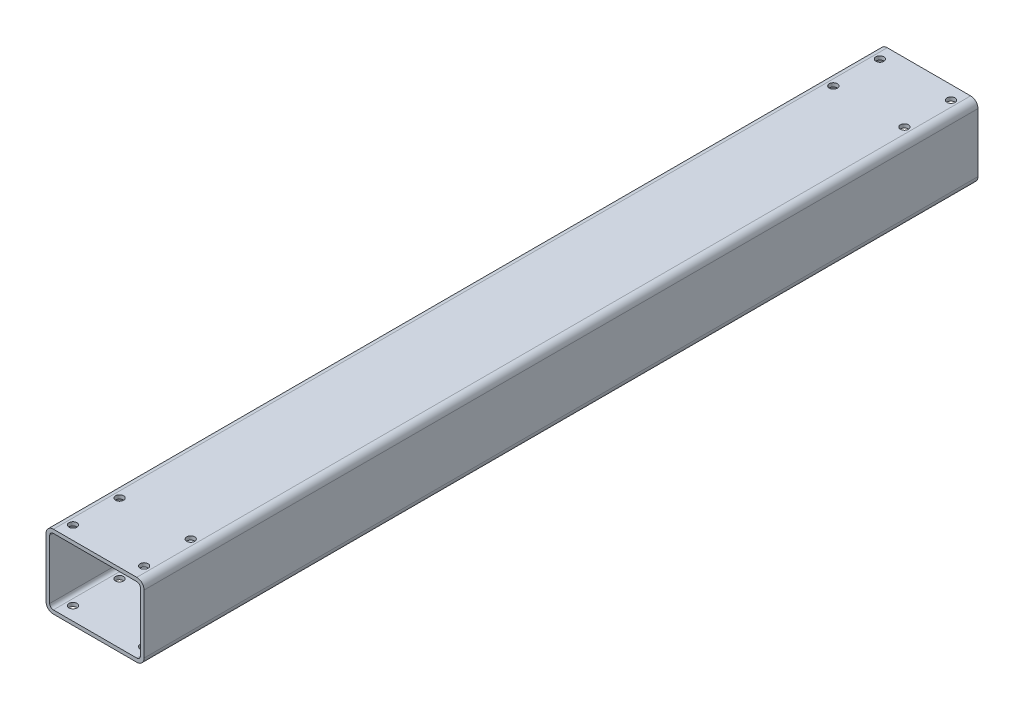
ISO-10303-21;
HEADER;
FILE_DESCRIPTION(('STEP AP214'),'2;1');
FILE_NAME('part.step','',(''),(''),'','','');
FILE_SCHEMA(('AUTOMOTIVE_DESIGN { 1 0 10303 214 1 1 1 1 }'));
ENDSEC;
DATA;
#1=APPLICATION_CONTEXT('core data for automotive mechanical design processes');
#2=APPLICATION_PROTOCOL_DEFINITION('international standard','automotive_design',2000,#1);
#3=PRODUCT_CONTEXT('',#1,'mechanical');
#4=PRODUCT('Part','Part','',(#3));
#5=PRODUCT_RELATED_PRODUCT_CATEGORY('part','',(#4));
#6=PRODUCT_DEFINITION_FORMATION('','',#4);
#7=PRODUCT_DEFINITION_CONTEXT('part definition',#1,'design');
#8=PRODUCT_DEFINITION('design','',#6,#7);
#9=PRODUCT_DEFINITION_SHAPE('','',#8);
#10=(LENGTH_UNIT() NAMED_UNIT(*) SI_UNIT(.MILLI.,.METRE.));
#11=(NAMED_UNIT(*) PLANE_ANGLE_UNIT() SI_UNIT($,.RADIAN.));
#12=(NAMED_UNIT(*) SI_UNIT($,.STERADIAN.) SOLID_ANGLE_UNIT());
#13=UNCERTAINTY_MEASURE_WITH_UNIT(LENGTH_MEASURE(1.E-05),#10,'distance_accuracy_value','');
#14=(GEOMETRIC_REPRESENTATION_CONTEXT(3) GLOBAL_UNCERTAINTY_ASSIGNED_CONTEXT((#13)) GLOBAL_UNIT_ASSIGNED_CONTEXT((#10,
#11,#12)) REPRESENTATION_CONTEXT('',''));
#15=CARTESIAN_POINT('',(0.,0.,0.));
#16=DIRECTION('',(0.,0.,1.));
#17=DIRECTION('',(1.,0.,0.));
#18=AXIS2_PLACEMENT_3D('',#15,#16,#17);
#19=CARTESIAN_POINT('',(-34.,30.,680.));
#20=DIRECTION('',(0.,-1.,0.));
#21=DIRECTION('',(1.,0.,0.));
#22=AXIS2_PLACEMENT_3D('',#19,#20,#21);
#23=PLANE('',#22);
#24=CARTESIAN_POINT('',(-29.,30.,669.));
#25=DIRECTION('',(0.,1.,0.));
#26=DIRECTION('',(0.,0.,1.));
#27=AXIS2_PLACEMENT_3D('',#24,#25,#26);
#28=CIRCLE('',#27,3.25000000000001);
#29=CARTESIAN_POINT('',(-29.,30.,672.25));
#30=VERTEX_POINT('',#29);
#31=EDGE_CURVE('E650',#30,#30,#28,.T.);
#32=ORIENTED_EDGE('',*,*,#31,.F.);
#33=EDGE_LOOP('',(#32));
#34=FACE_BOUND('',#33,.T.);
#35=CARTESIAN_POINT('',(-29.,30.,631.));
#36=DIRECTION('',(0.,1.,0.));
#37=DIRECTION('',(0.,0.,1.));
#38=AXIS2_PLACEMENT_3D('',#35,#36,#37);
#39=CIRCLE('',#38,3.25000000000001);
#40=CARTESIAN_POINT('',(-29.,30.,634.25));
#41=VERTEX_POINT('',#40);
#42=EDGE_CURVE('E658',#41,#41,#39,.T.);
#43=ORIENTED_EDGE('',*,*,#42,.F.);
#44=EDGE_LOOP('',(#43));
#45=FACE_BOUND('',#44,.T.);
#46=CARTESIAN_POINT('',(29.,30.,631.));
#47=DIRECTION('',(0.,1.,0.));
#48=DIRECTION('',(0.,0.,1.));
#49=AXIS2_PLACEMENT_3D('',#46,#47,#48);
#50=CIRCLE('',#49,3.25000000000001);
#51=CARTESIAN_POINT('',(29.,30.,634.25));
#52=VERTEX_POINT('',#51);
#53=EDGE_CURVE('E668',#52,#52,#50,.T.);
#54=ORIENTED_EDGE('',*,*,#53,.F.);
#55=EDGE_LOOP('',(#54));
#56=FACE_BOUND('',#55,.T.);
#57=CARTESIAN_POINT('',(-29.,30.,11.));
#58=DIRECTION('',(0.,1.,0.));
#59=DIRECTION('',(0.,0.,1.));
#60=AXIS2_PLACEMENT_3D('',#57,#58,#59);
#61=CIRCLE('',#60,3.25000000000001);
#62=CARTESIAN_POINT('',(-29.,30.,14.25));
#63=VERTEX_POINT('',#62);
#64=EDGE_CURVE('E459',#63,#63,#61,.T.);
#65=ORIENTED_EDGE('',*,*,#64,.F.);
#66=EDGE_LOOP('',(#65));
#67=FACE_BOUND('',#66,.T.);
#68=CARTESIAN_POINT('',(-29.,30.,49.));
#69=DIRECTION('',(0.,1.,0.));
#70=DIRECTION('',(0.,0.,1.));
#71=AXIS2_PLACEMENT_3D('',#68,#69,#70);
#72=CIRCLE('',#71,3.25000000000001);
#73=CARTESIAN_POINT('',(-29.,30.,52.25));
#74=VERTEX_POINT('',#73);
#75=EDGE_CURVE('E290',#74,#74,#72,.T.);
#76=ORIENTED_EDGE('',*,*,#75,.F.);
#77=EDGE_LOOP('',(#76));
#78=FACE_BOUND('',#77,.T.);
#79=CARTESIAN_POINT('',(29.,30.,11.));
#80=DIRECTION('',(0.,1.,0.));
#81=DIRECTION('',(0.,0.,1.));
#82=AXIS2_PLACEMENT_3D('',#79,#80,#81);
#83=CIRCLE('',#82,3.25000000000001);
#84=CARTESIAN_POINT('',(29.,30.,14.25));
#85=VERTEX_POINT('',#84);
#86=EDGE_CURVE('E287',#85,#85,#83,.T.);
#87=ORIENTED_EDGE('',*,*,#86,.F.);
#88=EDGE_LOOP('',(#87));
#89=FACE_BOUND('',#88,.T.);
#90=DIRECTION('',(-1.,0.,0.));
#91=VECTOR('',#90,1.);
#92=CARTESIAN_POINT('',(-34.,30.,0.));
#93=LINE('',#92,#91);
#94=CARTESIAN_POINT('',(34.,30.,0.));
#95=VERTEX_POINT('',#94);
#96=CARTESIAN_POINT('',(-34.,30.,0.));
#97=VERTEX_POINT('',#96);
#98=EDGE_CURVE('E252',#95,#97,#93,.T.);
#99=ORIENTED_EDGE('',*,*,#98,.T.);
#100=DIRECTION('',(0.,0.,-1.));
#101=VECTOR('',#100,1.);
#102=CARTESIAN_POINT('',(-34.,30.,680.));
#103=LINE('',#102,#101);
#104=CARTESIAN_POINT('',(-34.,30.,680.));
#105=VERTEX_POINT('',#104);
#106=EDGE_CURVE('E262',#105,#97,#103,.T.);
#107=ORIENTED_EDGE('',*,*,#106,.F.);
#108=DIRECTION('',(-1.,0.,0.));
#109=VECTOR('',#108,1.);
#110=CARTESIAN_POINT('',(-34.,30.,680.));
#111=LINE('',#110,#109);
#112=CARTESIAN_POINT('',(34.,30.,680.));
#113=VERTEX_POINT('',#112);
#114=EDGE_CURVE('E235',#113,#105,#111,.T.);
#115=ORIENTED_EDGE('',*,*,#114,.F.);
#116=DIRECTION('',(0.,0.,-1.));
#117=VECTOR('',#116,1.);
#118=CARTESIAN_POINT('',(34.,30.,680.));
#119=LINE('',#118,#117);
#120=EDGE_CURVE('E265',#113,#95,#119,.T.);
#121=ORIENTED_EDGE('',*,*,#120,.T.);
#122=EDGE_LOOP('',(#99,#107,#115,#121));
#123=FACE_BOUND('',#122,.T.);
#124=CARTESIAN_POINT('',(29.,30.,49.));
#125=DIRECTION('',(0.,1.,0.));
#126=DIRECTION('',(0.,0.,1.));
#127=AXIS2_PLACEMENT_3D('',#124,#125,#126);
#128=CIRCLE('',#127,3.25000000000001);
#129=CARTESIAN_POINT('',(29.,30.,52.25));
#130=VERTEX_POINT('',#129);
#131=EDGE_CURVE('E305',#130,#130,#128,.T.);
#132=ORIENTED_EDGE('',*,*,#131,.F.);
#133=EDGE_LOOP('',(#132));
#134=FACE_BOUND('',#133,.T.);
#135=CARTESIAN_POINT('',(29.,30.,669.));
#136=DIRECTION('',(0.,1.,0.));
#137=DIRECTION('',(0.,0.,1.));
#138=AXIS2_PLACEMENT_3D('',#135,#136,#137);
#139=CIRCLE('',#138,3.25000000000001);
#140=CARTESIAN_POINT('',(29.,30.,672.25));
#141=VERTEX_POINT('',#140);
#142=EDGE_CURVE('E444',#141,#141,#139,.T.);
#143=ORIENTED_EDGE('',*,*,#142,.F.);
#144=EDGE_LOOP('',(#143));
#145=FACE_BOUND('',#144,.T.);
#146=ADVANCED_FACE('F40',(#34,#45,#56,#67,#78,#89,#123,#134,#145),#23,.F.);
#147=CARTESIAN_POINT('',(-34.,-24.,680.));
#148=DIRECTION('',(0.,0.,-1.));
#149=DIRECTION('',(-1.,0.,0.));
#150=AXIS2_PLACEMENT_3D('',#147,#148,#149);
#151=PLANE('',#150);
#152=CARTESIAN_POINT('',(-34.,-24.,680.));
#153=DIRECTION('',(0.,0.,1.));
#154=DIRECTION('',(-1.,0.,0.));
#155=AXIS2_PLACEMENT_3D('',#152,#153,#154);
#156=CIRCLE('',#155,6.);
#157=CARTESIAN_POINT('',(-40.,-24.,680.));
#158=VERTEX_POINT('',#157);
#159=CARTESIAN_POINT('',(-34.,-30.,680.));
#160=VERTEX_POINT('',#159);
#161=EDGE_CURVE('E223',#158,#160,#156,.T.);
#162=ORIENTED_EDGE('',*,*,#161,.T.);
#163=DIRECTION('',(1.,0.,0.));
#164=VECTOR('',#163,1.);
#165=CARTESIAN_POINT('',(-34.,-30.,680.));
#166=LINE('',#165,#164);
#167=CARTESIAN_POINT('',(34.,-30.,680.));
#168=VERTEX_POINT('',#167);
#169=EDGE_CURVE('E226',#160,#168,#166,.T.);
#170=ORIENTED_EDGE('',*,*,#169,.T.);
#171=CARTESIAN_POINT('',(34.,-24.,680.));
#172=DIRECTION('',(0.,0.,1.));
#173=DIRECTION('',(-1.,0.,0.));
#174=AXIS2_PLACEMENT_3D('',#171,#172,#173);
#175=CIRCLE('',#174,6.);
#176=CARTESIAN_POINT('',(40.,-24.,680.));
#177=VERTEX_POINT('',#176);
#178=EDGE_CURVE('E229',#168,#177,#175,.T.);
#179=ORIENTED_EDGE('',*,*,#178,.T.);
#180=DIRECTION('',(0.,1.,0.));
#181=VECTOR('',#180,1.);
#182=CARTESIAN_POINT('',(40.,-24.,680.));
#183=LINE('',#182,#181);
#184=CARTESIAN_POINT('',(40.,24.,680.));
#185=VERTEX_POINT('',#184);
#186=EDGE_CURVE('E231',#177,#185,#183,.T.);
#187=ORIENTED_EDGE('',*,*,#186,.T.);
#188=CARTESIAN_POINT('',(34.,24.,680.));
#189=DIRECTION('',(0.,0.,1.));
#190=DIRECTION('',(1.,0.,0.));
#191=AXIS2_PLACEMENT_3D('',#188,#189,#190);
#192=CIRCLE('',#191,6.);
#193=EDGE_CURVE('E233',#185,#113,#192,.T.);
#194=ORIENTED_EDGE('',*,*,#193,.T.);
#195=ORIENTED_EDGE('',*,*,#114,.T.);
#196=CARTESIAN_POINT('',(-34.,24.,680.));
#197=DIRECTION('',(0.,0.,1.));
#198=DIRECTION('',(-1.,0.,0.));
#199=AXIS2_PLACEMENT_3D('',#196,#197,#198);
#200=CIRCLE('',#199,6.);
#201=CARTESIAN_POINT('',(-40.,24.,680.));
#202=VERTEX_POINT('',#201);
#203=EDGE_CURVE('E237',#105,#202,#200,.T.);
#204=ORIENTED_EDGE('',*,*,#203,.T.);
#205=DIRECTION('',(0.,-1.,0.));
#206=VECTOR('',#205,1.);
#207=CARTESIAN_POINT('',(-40.,-24.,680.));
#208=LINE('',#207,#206);
#209=EDGE_CURVE('E239',#202,#158,#208,.T.);
#210=ORIENTED_EDGE('',*,*,#209,.T.);
#211=EDGE_LOOP('',(#162,#170,#179,#187,#194,#195,#204,#210));
#212=FACE_BOUND('',#211,.T.);
#213=CARTESIAN_POINT('',(-34.,24.,680.));
#214=DIRECTION('',(0.,0.,1.));
#215=DIRECTION('',(-1.,0.,0.));
#216=AXIS2_PLACEMENT_3D('',#213,#214,#215);
#217=CIRCLE('',#216,3.);
#218=CARTESIAN_POINT('',(-34.,27.,680.));
#219=VERTEX_POINT('',#218);
#220=CARTESIAN_POINT('',(-37.,24.,680.));
#221=VERTEX_POINT('',#220);
#222=EDGE_CURVE('E155',#219,#221,#217,.T.);
#223=ORIENTED_EDGE('',*,*,#222,.F.);
#224=DIRECTION('',(-1.,0.,0.));
#225=VECTOR('',#224,1.);
#226=CARTESIAN_POINT('',(-34.,27.,680.));
#227=LINE('',#226,#225);
#228=CARTESIAN_POINT('',(34.,27.,680.));
#229=VERTEX_POINT('',#228);
#230=EDGE_CURVE('E190',#229,#219,#227,.T.);
#231=ORIENTED_EDGE('',*,*,#230,.F.);
#232=CARTESIAN_POINT('',(34.,24.,680.));
#233=DIRECTION('',(0.,0.,1.));
#234=DIRECTION('',(1.,0.,0.));
#235=AXIS2_PLACEMENT_3D('',#232,#233,#234);
#236=CIRCLE('',#235,3.);
#237=CARTESIAN_POINT('',(37.,24.,680.));
#238=VERTEX_POINT('',#237);
#239=EDGE_CURVE('E188',#238,#229,#236,.T.);
#240=ORIENTED_EDGE('',*,*,#239,.F.);
#241=DIRECTION('',(0.,1.,0.));
#242=VECTOR('',#241,1.);
#243=CARTESIAN_POINT('',(37.,-24.,680.));
#244=LINE('',#243,#242);
#245=CARTESIAN_POINT('',(37.,-24.,680.));
#246=VERTEX_POINT('',#245);
#247=EDGE_CURVE('E186',#246,#238,#244,.T.);
#248=ORIENTED_EDGE('',*,*,#247,.F.);
#249=CARTESIAN_POINT('',(34.,-24.,680.));
#250=DIRECTION('',(0.,0.,1.));
#251=DIRECTION('',(-1.,0.,0.));
#252=AXIS2_PLACEMENT_3D('',#249,#250,#251);
#253=CIRCLE('',#252,3.);
#254=CARTESIAN_POINT('',(34.,-27.,680.));
#255=VERTEX_POINT('',#254);
#256=EDGE_CURVE('E184',#255,#246,#253,.T.);
#257=ORIENTED_EDGE('',*,*,#256,.F.);
#258=DIRECTION('',(1.,0.,0.));
#259=VECTOR('',#258,1.);
#260=CARTESIAN_POINT('',(-34.,-27.,680.));
#261=LINE('',#260,#259);
#262=CARTESIAN_POINT('',(-34.,-27.,680.));
#263=VERTEX_POINT('',#262);
#264=EDGE_CURVE('E179',#263,#255,#261,.T.);
#265=ORIENTED_EDGE('',*,*,#264,.F.);
#266=CARTESIAN_POINT('',(-34.,-24.,680.));
#267=DIRECTION('',(0.,0.,1.));
#268=DIRECTION('',(-1.,0.,0.));
#269=AXIS2_PLACEMENT_3D('',#266,#267,#268);
#270=CIRCLE('',#269,3.);
#271=CARTESIAN_POINT('',(-37.,-24.,680.));
#272=VERTEX_POINT('',#271);
#273=EDGE_CURVE('E177',#272,#263,#270,.T.);
#274=ORIENTED_EDGE('',*,*,#273,.F.);
#275=DIRECTION('',(0.,-1.,0.));
#276=VECTOR('',#275,1.);
#277=CARTESIAN_POINT('',(-37.,-24.,680.));
#278=LINE('',#277,#276);
#279=EDGE_CURVE('E163',#221,#272,#278,.T.);
#280=ORIENTED_EDGE('',*,*,#279,.F.);
#281=EDGE_LOOP('',(#223,#231,#240,#248,#257,#265,#274,#280));
#282=FACE_BOUND('',#281,.T.);
#283=ADVANCED_FACE('F175',(#212,#282),#151,.F.);
#284=CARTESIAN_POINT('',(-34.,-24.,0.));
#285=DIRECTION('',(0.,0.,-1.));
#286=DIRECTION('',(-1.,0.,0.));
#287=AXIS2_PLACEMENT_3D('',#284,#285,#286);
#288=PLANE('',#287);
#289=CARTESIAN_POINT('',(-34.,-24.,0.));
#290=DIRECTION('',(0.,0.,1.));
#291=DIRECTION('',(-1.,0.,0.));
#292=AXIS2_PLACEMENT_3D('',#289,#290,#291);
#293=CIRCLE('',#292,6.);
#294=CARTESIAN_POINT('',(-40.,-24.,0.));
#295=VERTEX_POINT('',#294);
#296=CARTESIAN_POINT('',(-34.,-30.,0.));
#297=VERTEX_POINT('',#296);
#298=EDGE_CURVE('E171',#295,#297,#293,.T.);
#299=ORIENTED_EDGE('',*,*,#298,.F.);
#300=DIRECTION('',(0.,-1.,0.));
#301=VECTOR('',#300,1.);
#302=CARTESIAN_POINT('',(-40.,-24.,0.));
#303=LINE('',#302,#301);
#304=CARTESIAN_POINT('',(-40.,24.,0.));
#305=VERTEX_POINT('',#304);
#306=EDGE_CURVE('E227',#305,#295,#303,.T.);
#307=ORIENTED_EDGE('',*,*,#306,.F.);
#308=CARTESIAN_POINT('',(-34.,24.,0.));
#309=DIRECTION('',(0.,0.,1.));
#310=DIRECTION('',(-1.,0.,0.));
#311=AXIS2_PLACEMENT_3D('',#308,#309,#310);
#312=CIRCLE('',#311,6.);
#313=EDGE_CURVE('E254',#97,#305,#312,.T.);
#314=ORIENTED_EDGE('',*,*,#313,.F.);
#315=ORIENTED_EDGE('',*,*,#98,.F.);
#316=CARTESIAN_POINT('',(34.,24.,0.));
#317=DIRECTION('',(0.,0.,1.));
#318=DIRECTION('',(1.,0.,0.));
#319=AXIS2_PLACEMENT_3D('',#316,#317,#318);
#320=CIRCLE('',#319,6.);
#321=CARTESIAN_POINT('',(40.,24.,0.));
#322=VERTEX_POINT('',#321);
#323=EDGE_CURVE('E250',#322,#95,#320,.T.);
#324=ORIENTED_EDGE('',*,*,#323,.F.);
#325=DIRECTION('',(0.,1.,0.));
#326=VECTOR('',#325,1.);
#327=CARTESIAN_POINT('',(40.,-24.,0.));
#328=LINE('',#327,#326);
#329=CARTESIAN_POINT('',(40.,-24.,0.));
#330=VERTEX_POINT('',#329);
#331=EDGE_CURVE('E248',#330,#322,#328,.T.);
#332=ORIENTED_EDGE('',*,*,#331,.F.);
#333=CARTESIAN_POINT('',(34.,-24.,0.));
#334=DIRECTION('',(0.,0.,1.));
#335=DIRECTION('',(-1.,0.,0.));
#336=AXIS2_PLACEMENT_3D('',#333,#334,#335);
#337=CIRCLE('',#336,6.);
#338=CARTESIAN_POINT('',(34.,-30.,0.));
#339=VERTEX_POINT('',#338);
#340=EDGE_CURVE('E246',#339,#330,#337,.T.);
#341=ORIENTED_EDGE('',*,*,#340,.F.);
#342=DIRECTION('',(1.,0.,0.));
#343=VECTOR('',#342,1.);
#344=CARTESIAN_POINT('',(-34.,-30.,0.));
#345=LINE('',#344,#343);
#346=EDGE_CURVE('E244',#297,#339,#345,.T.);
#347=ORIENTED_EDGE('',*,*,#346,.F.);
#348=EDGE_LOOP('',(#299,#307,#314,#315,#324,#332,#341,#347));
#349=FACE_BOUND('',#348,.T.);
#350=DIRECTION('',(-1.,0.,0.));
#351=VECTOR('',#350,1.);
#352=CARTESIAN_POINT('',(-34.,27.,0.));
#353=LINE('',#352,#351);
#354=CARTESIAN_POINT('',(34.,27.,0.));
#355=VERTEX_POINT('',#354);
#356=CARTESIAN_POINT('',(-34.,27.,0.));
#357=VERTEX_POINT('',#356);
#358=EDGE_CURVE('E164',#355,#357,#353,.T.);
#359=ORIENTED_EDGE('',*,*,#358,.T.);
#360=CARTESIAN_POINT('',(-34.,24.,0.));
#361=DIRECTION('',(0.,0.,1.));
#362=DIRECTION('',(-1.,0.,0.));
#363=AXIS2_PLACEMENT_3D('',#360,#361,#362);
#364=CIRCLE('',#363,3.);
#365=CARTESIAN_POINT('',(-37.,24.,0.));
#366=VERTEX_POINT('',#365);
#367=EDGE_CURVE('E65',#357,#366,#364,.T.);
#368=ORIENTED_EDGE('',*,*,#367,.T.);
#369=DIRECTION('',(0.,-1.,0.));
#370=VECTOR('',#369,1.);
#371=CARTESIAN_POINT('',(-37.,-24.,0.));
#372=LINE('',#371,#370);
#373=CARTESIAN_POINT('',(-37.,-24.,0.));
#374=VERTEX_POINT('',#373);
#375=EDGE_CURVE('E170',#366,#374,#372,.T.);
#376=ORIENTED_EDGE('',*,*,#375,.T.);
#377=CARTESIAN_POINT('',(-34.,-24.,0.));
#378=DIRECTION('',(0.,0.,1.));
#379=DIRECTION('',(-1.,0.,0.));
#380=AXIS2_PLACEMENT_3D('',#377,#378,#379);
#381=CIRCLE('',#380,3.);
#382=CARTESIAN_POINT('',(-34.,-27.,0.));
#383=VERTEX_POINT('',#382);
#384=EDGE_CURVE('E195',#374,#383,#381,.T.);
#385=ORIENTED_EDGE('',*,*,#384,.T.);
#386=DIRECTION('',(1.,0.,0.));
#387=VECTOR('',#386,1.);
#388=CARTESIAN_POINT('',(-34.,-27.,0.));
#389=LINE('',#388,#387);
#390=CARTESIAN_POINT('',(34.,-27.,0.));
#391=VERTEX_POINT('',#390);
#392=EDGE_CURVE('E198',#383,#391,#389,.T.);
#393=ORIENTED_EDGE('',*,*,#392,.T.);
#394=CARTESIAN_POINT('',(34.,-24.,0.));
#395=DIRECTION('',(0.,0.,1.));
#396=DIRECTION('',(-1.,0.,0.));
#397=AXIS2_PLACEMENT_3D('',#394,#395,#396);
#398=CIRCLE('',#397,3.);
#399=CARTESIAN_POINT('',(37.,-24.,0.));
#400=VERTEX_POINT('',#399);
#401=EDGE_CURVE('E201',#391,#400,#398,.T.);
#402=ORIENTED_EDGE('',*,*,#401,.T.);
#403=DIRECTION('',(0.,1.,0.));
#404=VECTOR('',#403,1.);
#405=CARTESIAN_POINT('',(37.,-24.,0.));
#406=LINE('',#405,#404);
#407=CARTESIAN_POINT('',(37.,24.,0.));
#408=VERTEX_POINT('',#407);
#409=EDGE_CURVE('E204',#400,#408,#406,.T.);
#410=ORIENTED_EDGE('',*,*,#409,.T.);
#411=CARTESIAN_POINT('',(34.,24.,0.));
#412=DIRECTION('',(0.,0.,1.));
#413=DIRECTION('',(1.,0.,0.));
#414=AXIS2_PLACEMENT_3D('',#411,#412,#413);
#415=CIRCLE('',#414,3.);
#416=EDGE_CURVE('E207',#408,#355,#415,.T.);
#417=ORIENTED_EDGE('',*,*,#416,.T.);
#418=EDGE_LOOP('',(#359,#368,#376,#385,#393,#402,#410,#417));
#419=FACE_BOUND('',#418,.T.);
#420=ADVANCED_FACE('F326',(#349,#419),#288,.T.);
#421=CARTESIAN_POINT('',(-34.,-24.,680.));
#422=DIRECTION('',(0.,0.,-1.));
#423=DIRECTION('',(-1.,0.,0.));
#424=AXIS2_PLACEMENT_3D('',#421,#422,#423);
#425=CYLINDRICAL_SURFACE('',#424,6.);
#426=ORIENTED_EDGE('',*,*,#298,.T.);
#427=DIRECTION('',(0.,0.,-1.));
#428=VECTOR('',#427,1.);
#429=CARTESIAN_POINT('',(-34.,-30.,680.));
#430=LINE('',#429,#428);
#431=EDGE_CURVE('E11',#160,#297,#430,.T.);
#432=ORIENTED_EDGE('',*,*,#431,.F.);
#433=ORIENTED_EDGE('',*,*,#161,.F.);
#434=DIRECTION('',(0.,0.,-1.));
#435=VECTOR('',#434,1.);
#436=CARTESIAN_POINT('',(-40.,-24.,680.));
#437=LINE('',#436,#435);
#438=EDGE_CURVE('E241',#158,#295,#437,.T.);
#439=ORIENTED_EDGE('',*,*,#438,.T.);
#440=EDGE_LOOP('',(#426,#432,#433,#439));
#441=FACE_BOUND('',#440,.T.);
#442=ADVANCED_FACE('F42',(#441),#425,.T.);
#443=CARTESIAN_POINT('',(-34.,-30.,680.));
#444=DIRECTION('',(0.,1.,0.));
#445=DIRECTION('',(-1.,0.,0.));
#446=AXIS2_PLACEMENT_3D('',#443,#444,#445);
#447=PLANE('',#446);
#448=CARTESIAN_POINT('',(-29.,-30.,669.));
#449=DIRECTION('',(0.,1.,0.));
#450=DIRECTION('',(0.,0.,1.));
#451=AXIS2_PLACEMENT_3D('',#448,#449,#450);
#452=CIRCLE('',#451,3.25000000000001);
#453=CARTESIAN_POINT('',(-29.,-30.,672.25));
#454=VERTEX_POINT('',#453);
#455=EDGE_CURVE('E391',#454,#454,#452,.T.);
#456=ORIENTED_EDGE('',*,*,#455,.T.);
#457=EDGE_LOOP('',(#456));
#458=FACE_BOUND('',#457,.T.);
#459=CARTESIAN_POINT('',(-29.,-30.,631.));
#460=DIRECTION('',(0.,1.,0.));
#461=DIRECTION('',(0.,0.,1.));
#462=AXIS2_PLACEMENT_3D('',#459,#460,#461);
#463=CIRCLE('',#462,3.25000000000001);
#464=CARTESIAN_POINT('',(-29.,-30.,634.25));
#465=VERTEX_POINT('',#464);
#466=EDGE_CURVE('E395',#465,#465,#463,.T.);
#467=ORIENTED_EDGE('',*,*,#466,.T.);
#468=EDGE_LOOP('',(#467));
#469=FACE_BOUND('',#468,.T.);
#470=CARTESIAN_POINT('',(29.,-30.,631.));
#471=DIRECTION('',(0.,1.,0.));
#472=DIRECTION('',(0.,0.,1.));
#473=AXIS2_PLACEMENT_3D('',#470,#471,#472);
#474=CIRCLE('',#473,3.25);
#475=CARTESIAN_POINT('',(29.,-30.,634.25));
#476=VERTEX_POINT('',#475);
#477=EDGE_CURVE('E399',#476,#476,#474,.T.);
#478=ORIENTED_EDGE('',*,*,#477,.T.);
#479=EDGE_LOOP('',(#478));
#480=FACE_BOUND('',#479,.T.);
#481=CARTESIAN_POINT('',(29.,-30.,669.));
#482=DIRECTION('',(0.,1.,0.));
#483=DIRECTION('',(0.,0.,1.));
#484=AXIS2_PLACEMENT_3D('',#481,#482,#483);
#485=CIRCLE('',#484,3.25000000000001);
#486=CARTESIAN_POINT('',(29.,-30.,672.25));
#487=VERTEX_POINT('',#486);
#488=EDGE_CURVE('E403',#487,#487,#485,.T.);
#489=ORIENTED_EDGE('',*,*,#488,.T.);
#490=EDGE_LOOP('',(#489));
#491=FACE_BOUND('',#490,.T.);
#492=CARTESIAN_POINT('',(-29.,-30.,11.));
#493=DIRECTION('',(0.,1.,0.));
#494=DIRECTION('',(0.,0.,1.));
#495=AXIS2_PLACEMENT_3D('',#492,#493,#494);
#496=CIRCLE('',#495,3.25000000000001);
#497=CARTESIAN_POINT('',(-29.,-30.,14.25));
#498=VERTEX_POINT('',#497);
#499=EDGE_CURVE('E406',#498,#498,#496,.T.);
#500=ORIENTED_EDGE('',*,*,#499,.T.);
#501=EDGE_LOOP('',(#500));
#502=FACE_BOUND('',#501,.T.);
#503=CARTESIAN_POINT('',(-29.,-30.,49.));
#504=DIRECTION('',(0.,1.,0.));
#505=DIRECTION('',(0.,0.,1.));
#506=AXIS2_PLACEMENT_3D('',#503,#504,#505);
#507=CIRCLE('',#506,3.25000000000001);
#508=CARTESIAN_POINT('',(-29.,-30.,52.25));
#509=VERTEX_POINT('',#508);
#510=EDGE_CURVE('E283',#509,#509,#507,.T.);
#511=ORIENTED_EDGE('',*,*,#510,.T.);
#512=EDGE_LOOP('',(#511));
#513=FACE_BOUND('',#512,.T.);
#514=CARTESIAN_POINT('',(29.,-30.,11.));
#515=DIRECTION('',(0.,1.,0.));
#516=DIRECTION('',(0.,0.,1.));
#517=AXIS2_PLACEMENT_3D('',#514,#515,#516);
#518=CIRCLE('',#517,3.25000000000001);
#519=CARTESIAN_POINT('',(29.,-30.,14.25));
#520=VERTEX_POINT('',#519);
#521=EDGE_CURVE('E279',#520,#520,#518,.T.);
#522=ORIENTED_EDGE('',*,*,#521,.T.);
#523=EDGE_LOOP('',(#522));
#524=FACE_BOUND('',#523,.T.);
#525=CARTESIAN_POINT('',(29.,-30.,49.));
#526=DIRECTION('',(0.,1.,0.));
#527=DIRECTION('',(0.,0.,1.));
#528=AXIS2_PLACEMENT_3D('',#525,#526,#527);
#529=CIRCLE('',#528,3.25);
#530=CARTESIAN_POINT('',(29.,-30.,52.25));
#531=VERTEX_POINT('',#530);
#532=EDGE_CURVE('E308',#531,#531,#529,.T.);
#533=ORIENTED_EDGE('',*,*,#532,.T.);
#534=EDGE_LOOP('',(#533));
#535=FACE_BOUND('',#534,.T.);
#536=ORIENTED_EDGE('',*,*,#346,.T.);
#537=DIRECTION('',(0.,0.,-1.));
#538=VECTOR('',#537,1.);
#539=CARTESIAN_POINT('',(34.,-30.,680.));
#540=LINE('',#539,#538);
#541=EDGE_CURVE('E49',#168,#339,#540,.T.);
#542=ORIENTED_EDGE('',*,*,#541,.F.);
#543=ORIENTED_EDGE('',*,*,#169,.F.);
#544=ORIENTED_EDGE('',*,*,#431,.T.);
#545=EDGE_LOOP('',(#536,#542,#543,#544));
#546=FACE_BOUND('',#545,.T.);
#547=ADVANCED_FACE('F380',(#458,#469,#480,#491,#502,#513,#524,#535,#546),#447,.F.);
#548=CARTESIAN_POINT('',(34.,-24.,680.));
#549=DIRECTION('',(0.,0.,-1.));
#550=DIRECTION('',(-1.,0.,0.));
#551=AXIS2_PLACEMENT_3D('',#548,#549,#550);
#552=CYLINDRICAL_SURFACE('',#551,6.);
#553=ORIENTED_EDGE('',*,*,#340,.T.);
#554=DIRECTION('',(0.,0.,-1.));
#555=VECTOR('',#554,1.);
#556=CARTESIAN_POINT('',(40.,-24.,680.));
#557=LINE('',#556,#555);
#558=EDGE_CURVE('E271',#177,#330,#557,.T.);
#559=ORIENTED_EDGE('',*,*,#558,.F.);
#560=ORIENTED_EDGE('',*,*,#178,.F.);
#561=ORIENTED_EDGE('',*,*,#541,.T.);
#562=EDGE_LOOP('',(#553,#559,#560,#561));
#563=FACE_BOUND('',#562,.T.);
#564=ADVANCED_FACE('F377',(#563),#552,.T.);
#565=CARTESIAN_POINT('',(40.,-24.,680.));
#566=DIRECTION('',(-1.,0.,0.));
#567=DIRECTION('',(0.,-1.,0.));
#568=AXIS2_PLACEMENT_3D('',#565,#566,#567);
#569=PLANE('',#568);
#570=ORIENTED_EDGE('',*,*,#331,.T.);
#571=DIRECTION('',(0.,0.,-1.));
#572=VECTOR('',#571,1.);
#573=CARTESIAN_POINT('',(40.,24.,680.));
#574=LINE('',#573,#572);
#575=EDGE_CURVE('E268',#185,#322,#574,.T.);
#576=ORIENTED_EDGE('',*,*,#575,.F.);
#577=ORIENTED_EDGE('',*,*,#186,.F.);
#578=ORIENTED_EDGE('',*,*,#558,.T.);
#579=EDGE_LOOP('',(#570,#576,#577,#578));
#580=FACE_BOUND('',#579,.T.);
#581=ADVANCED_FACE('F373',(#580),#569,.F.);
#582=CARTESIAN_POINT('',(34.,24.,680.));
#583=DIRECTION('',(0.,0.,-1.));
#584=DIRECTION('',(-1.,0.,0.));
#585=AXIS2_PLACEMENT_3D('',#582,#583,#584);
#586=CYLINDRICAL_SURFACE('',#585,6.);
#587=ORIENTED_EDGE('',*,*,#323,.T.);
#588=ORIENTED_EDGE('',*,*,#120,.F.);
#589=ORIENTED_EDGE('',*,*,#193,.F.);
#590=ORIENTED_EDGE('',*,*,#575,.T.);
#591=EDGE_LOOP('',(#587,#588,#589,#590));
#592=FACE_BOUND('',#591,.T.);
#593=ADVANCED_FACE('F370',(#592),#586,.T.);
#594=CARTESIAN_POINT('',(-34.,24.,680.));
#595=DIRECTION('',(0.,0.,-1.));
#596=DIRECTION('',(-1.,0.,0.));
#597=AXIS2_PLACEMENT_3D('',#594,#595,#596);
#598=CYLINDRICAL_SURFACE('',#597,6.);
#599=ORIENTED_EDGE('',*,*,#313,.T.);
#600=DIRECTION('',(0.,0.,-1.));
#601=VECTOR('',#600,1.);
#602=CARTESIAN_POINT('',(-40.,24.,680.));
#603=LINE('',#602,#601);
#604=EDGE_CURVE('E259',#202,#305,#603,.T.);
#605=ORIENTED_EDGE('',*,*,#604,.F.);
#606=ORIENTED_EDGE('',*,*,#203,.F.);
#607=ORIENTED_EDGE('',*,*,#106,.T.);
#608=EDGE_LOOP('',(#599,#605,#606,#607));
#609=FACE_BOUND('',#608,.T.);
#610=ADVANCED_FACE('F368',(#609),#598,.T.);
#611=CARTESIAN_POINT('',(-40.,-24.,680.));
#612=DIRECTION('',(1.,0.,0.));
#613=DIRECTION('',(0.,1.,0.));
#614=AXIS2_PLACEMENT_3D('',#611,#612,#613);
#615=PLANE('',#614);
#616=ORIENTED_EDGE('',*,*,#306,.T.);
#617=ORIENTED_EDGE('',*,*,#438,.F.);
#618=ORIENTED_EDGE('',*,*,#209,.F.);
#619=ORIENTED_EDGE('',*,*,#604,.T.);
#620=EDGE_LOOP('',(#616,#617,#618,#619));
#621=FACE_BOUND('',#620,.T.);
#622=ADVANCED_FACE('F434',(#621),#615,.F.);
#623=CARTESIAN_POINT('',(-34.,24.,680.));
#624=DIRECTION('',(0.,0.,-1.));
#625=DIRECTION('',(-1.,0.,0.));
#626=AXIS2_PLACEMENT_3D('',#623,#624,#625);
#627=CYLINDRICAL_SURFACE('',#626,3.);
#628=ORIENTED_EDGE('',*,*,#367,.F.);
#629=DIRECTION('',(0.,0.,-1.));
#630=VECTOR('',#629,1.);
#631=CARTESIAN_POINT('',(-34.,27.,680.));
#632=LINE('',#631,#630);
#633=EDGE_CURVE('E159',#219,#357,#632,.T.);
#634=ORIENTED_EDGE('',*,*,#633,.F.);
#635=ORIENTED_EDGE('',*,*,#222,.T.);
#636=DIRECTION('',(0.,0.,-1.));
#637=VECTOR('',#636,1.);
#638=CARTESIAN_POINT('',(-37.,24.,680.));
#639=LINE('',#638,#637);
#640=EDGE_CURVE('E158',#221,#366,#639,.T.);
#641=ORIENTED_EDGE('',*,*,#640,.T.);
#642=EDGE_LOOP('',(#628,#634,#635,#641));
#643=FACE_BOUND('',#642,.T.);
#644=ADVANCED_FACE('F157',(#643),#627,.F.);
#645=CARTESIAN_POINT('',(-37.,-24.,680.));
#646=DIRECTION('',(1.,0.,0.));
#647=DIRECTION('',(0.,1.,0.));
#648=AXIS2_PLACEMENT_3D('',#645,#646,#647);
#649=PLANE('',#648);
#650=ORIENTED_EDGE('',*,*,#375,.F.);
#651=ORIENTED_EDGE('',*,*,#640,.F.);
#652=ORIENTED_EDGE('',*,*,#279,.T.);
#653=DIRECTION('',(0.,0.,-1.));
#654=VECTOR('',#653,1.);
#655=CARTESIAN_POINT('',(-37.,-24.,680.));
#656=LINE('',#655,#654);
#657=EDGE_CURVE('E172',#272,#374,#656,.T.);
#658=ORIENTED_EDGE('',*,*,#657,.T.);
#659=EDGE_LOOP('',(#650,#651,#652,#658));
#660=FACE_BOUND('',#659,.T.);
#661=ADVANCED_FACE('F167',(#660),#649,.T.);
#662=CARTESIAN_POINT('',(-34.,-24.,680.));
#663=DIRECTION('',(0.,0.,-1.));
#664=DIRECTION('',(-1.,0.,0.));
#665=AXIS2_PLACEMENT_3D('',#662,#663,#664);
#666=CYLINDRICAL_SURFACE('',#665,3.);
#667=ORIENTED_EDGE('',*,*,#384,.F.);
#668=ORIENTED_EDGE('',*,*,#657,.F.);
#669=ORIENTED_EDGE('',*,*,#273,.T.);
#670=DIRECTION('',(0.,0.,-1.));
#671=VECTOR('',#670,1.);
#672=CARTESIAN_POINT('',(-34.,-27.,680.));
#673=LINE('',#672,#671);
#674=EDGE_CURVE('E220',#263,#383,#673,.T.);
#675=ORIENTED_EDGE('',*,*,#674,.T.);
#676=EDGE_LOOP('',(#667,#668,#669,#675));
#677=FACE_BOUND('',#676,.T.);
#678=ADVANCED_FACE('F346',(#677),#666,.F.);
#679=CARTESIAN_POINT('',(-34.,-27.,680.));
#680=DIRECTION('',(0.,1.,0.));
#681=DIRECTION('',(-1.,0.,0.));
#682=AXIS2_PLACEMENT_3D('',#679,#680,#681);
#683=PLANE('',#682);
#684=CARTESIAN_POINT('',(-29.,-27.,669.));
#685=DIRECTION('',(0.,1.,0.));
#686=DIRECTION('',(-1.,0.,0.));
#687=AXIS2_PLACEMENT_3D('',#684,#685,#686);
#688=CIRCLE('',#687,3.25000000000001);
#689=CARTESIAN_POINT('',(-32.25,-27.,669.));
#690=VERTEX_POINT('',#689);
#691=EDGE_CURVE('E655',#690,#690,#688,.T.);
#692=ORIENTED_EDGE('',*,*,#691,.F.);
#693=EDGE_LOOP('',(#692));
#694=FACE_BOUND('',#693,.T.);
#695=CARTESIAN_POINT('',(-29.,-27.,631.));
#696=DIRECTION('',(0.,1.,0.));
#697=DIRECTION('',(-1.,0.,0.));
#698=AXIS2_PLACEMENT_3D('',#695,#696,#697);
#699=CIRCLE('',#698,3.25000000000001);
#700=CARTESIAN_POINT('',(-32.25,-27.,631.));
#701=VERTEX_POINT('',#700);
#702=EDGE_CURVE('E662',#701,#701,#699,.T.);
#703=ORIENTED_EDGE('',*,*,#702,.F.);
#704=EDGE_LOOP('',(#703));
#705=FACE_BOUND('',#704,.T.);
#706=CARTESIAN_POINT('',(29.,-27.,631.));
#707=DIRECTION('',(0.,1.,0.));
#708=DIRECTION('',(-1.,0.,0.));
#709=AXIS2_PLACEMENT_3D('',#706,#707,#708);
#710=CIRCLE('',#709,3.25000000000001);
#711=CARTESIAN_POINT('',(25.75,-27.,631.));
#712=VERTEX_POINT('',#711);
#713=EDGE_CURVE('E446',#712,#712,#710,.T.);
#714=ORIENTED_EDGE('',*,*,#713,.F.);
#715=EDGE_LOOP('',(#714));
#716=FACE_BOUND('',#715,.T.);
#717=CARTESIAN_POINT('',(29.,-27.,669.));
#718=DIRECTION('',(0.,1.,0.));
#719=DIRECTION('',(-1.,0.,0.));
#720=AXIS2_PLACEMENT_3D('',#717,#718,#719);
#721=CIRCLE('',#720,3.25000000000001);
#722=CARTESIAN_POINT('',(25.75,-27.,669.));
#723=VERTEX_POINT('',#722);
#724=EDGE_CURVE('E448',#723,#723,#721,.T.);
#725=ORIENTED_EDGE('',*,*,#724,.F.);
#726=EDGE_LOOP('',(#725));
#727=FACE_BOUND('',#726,.T.);
#728=CARTESIAN_POINT('',(-29.,-27.,11.));
#729=DIRECTION('',(0.,1.,0.));
#730=DIRECTION('',(-1.,0.,0.));
#731=AXIS2_PLACEMENT_3D('',#728,#729,#730);
#732=CIRCLE('',#731,3.25000000000001);
#733=CARTESIAN_POINT('',(-32.25,-27.,11.));
#734=VERTEX_POINT('',#733);
#735=EDGE_CURVE('E463',#734,#734,#732,.T.);
#736=ORIENTED_EDGE('',*,*,#735,.F.);
#737=EDGE_LOOP('',(#736));
#738=FACE_BOUND('',#737,.T.);
#739=CARTESIAN_POINT('',(-29.,-27.,49.));
#740=DIRECTION('',(0.,1.,0.));
#741=DIRECTION('',(-1.,0.,0.));
#742=AXIS2_PLACEMENT_3D('',#739,#740,#741);
#743=CIRCLE('',#742,3.25000000000001);
#744=CARTESIAN_POINT('',(-32.25,-27.,49.));
#745=VERTEX_POINT('',#744);
#746=EDGE_CURVE('E282',#745,#745,#743,.T.);
#747=ORIENTED_EDGE('',*,*,#746,.F.);
#748=EDGE_LOOP('',(#747));
#749=FACE_BOUND('',#748,.T.);
#750=CARTESIAN_POINT('',(29.,-27.,11.));
#751=DIRECTION('',(0.,1.,0.));
#752=DIRECTION('',(-1.,0.,0.));
#753=AXIS2_PLACEMENT_3D('',#750,#751,#752);
#754=CIRCLE('',#753,3.25000000000001);
#755=CARTESIAN_POINT('',(25.75,-27.,11.));
#756=VERTEX_POINT('',#755);
#757=EDGE_CURVE('E276',#756,#756,#754,.T.);
#758=ORIENTED_EDGE('',*,*,#757,.F.);
#759=EDGE_LOOP('',(#758));
#760=FACE_BOUND('',#759,.T.);
#761=CARTESIAN_POINT('',(29.,-27.,49.));
#762=DIRECTION('',(0.,1.,0.));
#763=DIRECTION('',(-1.,0.,0.));
#764=AXIS2_PLACEMENT_3D('',#761,#762,#763);
#765=CIRCLE('',#764,3.25000000000001);
#766=CARTESIAN_POINT('',(25.75,-27.,49.));
#767=VERTEX_POINT('',#766);
#768=EDGE_CURVE('E311',#767,#767,#765,.T.);
#769=ORIENTED_EDGE('',*,*,#768,.F.);
#770=EDGE_LOOP('',(#769));
#771=FACE_BOUND('',#770,.T.);
#772=ORIENTED_EDGE('',*,*,#392,.F.);
#773=ORIENTED_EDGE('',*,*,#674,.F.);
#774=ORIENTED_EDGE('',*,*,#264,.T.);
#775=DIRECTION('',(0.,0.,-1.));
#776=VECTOR('',#775,1.);
#777=CARTESIAN_POINT('',(34.,-27.,680.));
#778=LINE('',#777,#776);
#779=EDGE_CURVE('E218',#255,#391,#778,.T.);
#780=ORIENTED_EDGE('',*,*,#779,.T.);
#781=EDGE_LOOP('',(#772,#773,#774,#780));
#782=FACE_BOUND('',#781,.T.);
#783=ADVANCED_FACE('F342',(#694,#705,#716,#727,#738,#749,#760,#771,#782),#683,.T.);
#784=CARTESIAN_POINT('',(34.,-24.,680.));
#785=DIRECTION('',(0.,0.,-1.));
#786=DIRECTION('',(-1.,0.,0.));
#787=AXIS2_PLACEMENT_3D('',#784,#785,#786);
#788=CYLINDRICAL_SURFACE('',#787,3.);
#789=ORIENTED_EDGE('',*,*,#401,.F.);
#790=ORIENTED_EDGE('',*,*,#779,.F.);
#791=ORIENTED_EDGE('',*,*,#256,.T.);
#792=DIRECTION('',(0.,0.,-1.));
#793=VECTOR('',#792,1.);
#794=CARTESIAN_POINT('',(37.,-24.,680.));
#795=LINE('',#794,#793);
#796=EDGE_CURVE('E216',#246,#400,#795,.T.);
#797=ORIENTED_EDGE('',*,*,#796,.T.);
#798=EDGE_LOOP('',(#789,#790,#791,#797));
#799=FACE_BOUND('',#798,.T.);
#800=ADVANCED_FACE('F338',(#799),#788,.F.);
#801=CARTESIAN_POINT('',(37.,-24.,680.));
#802=DIRECTION('',(-1.,0.,0.));
#803=DIRECTION('',(0.,0.,1.));
#804=AXIS2_PLACEMENT_3D('',#801,#802,#803);
#805=PLANE('',#804);
#806=ORIENTED_EDGE('',*,*,#409,.F.);
#807=ORIENTED_EDGE('',*,*,#796,.F.);
#808=ORIENTED_EDGE('',*,*,#247,.T.);
#809=DIRECTION('',(0.,0.,-1.));
#810=VECTOR('',#809,1.);
#811=CARTESIAN_POINT('',(37.,24.,680.));
#812=LINE('',#811,#810);
#813=EDGE_CURVE('E214',#238,#408,#812,.T.);
#814=ORIENTED_EDGE('',*,*,#813,.T.);
#815=EDGE_LOOP('',(#806,#807,#808,#814));
#816=FACE_BOUND('',#815,.T.);
#817=ADVANCED_FACE('F335',(#816),#805,.T.);
#818=CARTESIAN_POINT('',(34.,24.,680.));
#819=DIRECTION('',(0.,0.,-1.));
#820=DIRECTION('',(-1.,0.,0.));
#821=AXIS2_PLACEMENT_3D('',#818,#819,#820);
#822=CYLINDRICAL_SURFACE('',#821,3.);
#823=ORIENTED_EDGE('',*,*,#416,.F.);
#824=ORIENTED_EDGE('',*,*,#813,.F.);
#825=ORIENTED_EDGE('',*,*,#239,.T.);
#826=DIRECTION('',(0.,0.,-1.));
#827=VECTOR('',#826,1.);
#828=CARTESIAN_POINT('',(34.,27.,680.));
#829=LINE('',#828,#827);
#830=EDGE_CURVE('E57',#229,#355,#829,.T.);
#831=ORIENTED_EDGE('',*,*,#830,.T.);
#832=EDGE_LOOP('',(#823,#824,#825,#831));
#833=FACE_BOUND('',#832,.T.);
#834=ADVANCED_FACE('F321',(#833),#822,.F.);
#835=CARTESIAN_POINT('',(-34.,27.,680.));
#836=DIRECTION('',(0.,-1.,0.));
#837=DIRECTION('',(1.,0.,0.));
#838=AXIS2_PLACEMENT_3D('',#835,#836,#837);
#839=PLANE('',#838);
#840=CARTESIAN_POINT('',(-29.,27.,669.));
#841=DIRECTION('',(0.,-1.,0.));
#842=DIRECTION('',(1.,0.,0.));
#843=AXIS2_PLACEMENT_3D('',#840,#841,#842);
#844=CIRCLE('',#843,3.25000000000001);
#845=CARTESIAN_POINT('',(-25.75,27.,669.));
#846=VERTEX_POINT('',#845);
#847=EDGE_CURVE('E648',#846,#846,#844,.T.);
#848=ORIENTED_EDGE('',*,*,#847,.F.);
#849=EDGE_LOOP('',(#848));
#850=FACE_BOUND('',#849,.T.);
#851=CARTESIAN_POINT('',(-29.,27.,631.));
#852=DIRECTION('',(0.,-1.,0.));
#853=DIRECTION('',(1.,0.,0.));
#854=AXIS2_PLACEMENT_3D('',#851,#852,#853);
#855=CIRCLE('',#854,3.25000000000001);
#856=CARTESIAN_POINT('',(-25.75,27.,631.));
#857=VERTEX_POINT('',#856);
#858=EDGE_CURVE('E665',#857,#857,#855,.T.);
#859=ORIENTED_EDGE('',*,*,#858,.F.);
#860=EDGE_LOOP('',(#859));
#861=FACE_BOUND('',#860,.T.);
#862=CARTESIAN_POINT('',(29.,27.,631.));
#863=DIRECTION('',(0.,-1.,0.));
#864=DIRECTION('',(1.,0.,0.));
#865=AXIS2_PLACEMENT_3D('',#862,#863,#864);
#866=CIRCLE('',#865,3.25000000000001);
#867=CARTESIAN_POINT('',(32.25,27.,631.));
#868=VERTEX_POINT('',#867);
#869=EDGE_CURVE('E44',#868,#868,#866,.T.);
#870=ORIENTED_EDGE('',*,*,#869,.F.);
#871=EDGE_LOOP('',(#870));
#872=FACE_BOUND('',#871,.T.);
#873=CARTESIAN_POINT('',(29.,27.,669.));
#874=DIRECTION('',(0.,-1.,0.));
#875=DIRECTION('',(1.,0.,0.));
#876=AXIS2_PLACEMENT_3D('',#873,#874,#875);
#877=CIRCLE('',#876,3.25000000000001);
#878=CARTESIAN_POINT('',(32.25,27.,669.));
#879=VERTEX_POINT('',#878);
#880=EDGE_CURVE('E456',#879,#879,#877,.T.);
#881=ORIENTED_EDGE('',*,*,#880,.F.);
#882=EDGE_LOOP('',(#881));
#883=FACE_BOUND('',#882,.T.);
#884=CARTESIAN_POINT('',(-29.,27.,11.));
#885=DIRECTION('',(0.,-1.,0.));
#886=DIRECTION('',(1.,0.,0.));
#887=AXIS2_PLACEMENT_3D('',#884,#885,#886);
#888=CIRCLE('',#887,3.25000000000001);
#889=CARTESIAN_POINT('',(-25.75,27.,11.));
#890=VERTEX_POINT('',#889);
#891=EDGE_CURVE('E295',#890,#890,#888,.T.);
#892=ORIENTED_EDGE('',*,*,#891,.F.);
#893=EDGE_LOOP('',(#892));
#894=FACE_BOUND('',#893,.T.);
#895=CARTESIAN_POINT('',(-29.,27.,49.));
#896=DIRECTION('',(0.,-1.,0.));
#897=DIRECTION('',(1.,0.,0.));
#898=AXIS2_PLACEMENT_3D('',#895,#896,#897);
#899=CIRCLE('',#898,3.25000000000001);
#900=CARTESIAN_POINT('',(-25.75,27.,49.));
#901=VERTEX_POINT('',#900);
#902=EDGE_CURVE('E280',#901,#901,#899,.T.);
#903=ORIENTED_EDGE('',*,*,#902,.F.);
#904=EDGE_LOOP('',(#903));
#905=FACE_BOUND('',#904,.T.);
#906=CARTESIAN_POINT('',(29.,27.,11.));
#907=DIRECTION('',(0.,-1.,0.));
#908=DIRECTION('',(1.,0.,0.));
#909=AXIS2_PLACEMENT_3D('',#906,#907,#908);
#910=CIRCLE('',#909,3.25000000000001);
#911=CARTESIAN_POINT('',(32.25,27.,11.));
#912=VERTEX_POINT('',#911);
#913=EDGE_CURVE('E278',#912,#912,#910,.T.);
#914=ORIENTED_EDGE('',*,*,#913,.F.);
#915=EDGE_LOOP('',(#914));
#916=FACE_BOUND('',#915,.T.);
#917=CARTESIAN_POINT('',(29.,27.,49.));
#918=DIRECTION('',(0.,-1.,0.));
#919=DIRECTION('',(1.,0.,0.));
#920=AXIS2_PLACEMENT_3D('',#917,#918,#919);
#921=CIRCLE('',#920,3.25000000000001);
#922=CARTESIAN_POINT('',(32.25,27.,49.));
#923=VERTEX_POINT('',#922);
#924=EDGE_CURVE('E193',#923,#923,#921,.T.);
#925=ORIENTED_EDGE('',*,*,#924,.F.);
#926=EDGE_LOOP('',(#925));
#927=FACE_BOUND('',#926,.T.);
#928=ORIENTED_EDGE('',*,*,#358,.F.);
#929=ORIENTED_EDGE('',*,*,#830,.F.);
#930=ORIENTED_EDGE('',*,*,#230,.T.);
#931=ORIENTED_EDGE('',*,*,#633,.T.);
#932=EDGE_LOOP('',(#928,#929,#930,#931));
#933=FACE_BOUND('',#932,.T.);
#934=ADVANCED_FACE('F319',(#850,#861,#872,#883,#894,#905,#916,#927,#933),#839,.T.);
#935=CARTESIAN_POINT('',(29.,30.,49.));
#936=DIRECTION('',(0.,1.,0.));
#937=DIRECTION('',(0.,0.,1.));
#938=AXIS2_PLACEMENT_3D('',#935,#936,#937);
#939=CYLINDRICAL_SURFACE('',#938,3.25000000000001);
#940=ORIENTED_EDGE('',*,*,#924,.T.);
#941=EDGE_LOOP('',(#940));
#942=FACE_BOUND('',#941,.T.);
#943=ORIENTED_EDGE('',*,*,#131,.T.);
#944=EDGE_LOOP('',(#943));
#945=FACE_BOUND('',#944,.T.);
#946=ADVANCED_FACE('F316',(#942,#945),#939,.F.);
#947=ORIENTED_EDGE('',*,*,#768,.T.);
#948=EDGE_LOOP('',(#947));
#949=FACE_BOUND('',#948,.T.);
#950=ORIENTED_EDGE('',*,*,#532,.F.);
#951=EDGE_LOOP('',(#950));
#952=FACE_BOUND('',#951,.T.);
#953=ADVANCED_FACE('F489',(#949,#952),#939,.F.);
#954=CARTESIAN_POINT('',(29.,30.,11.));
#955=DIRECTION('',(0.,1.,0.));
#956=DIRECTION('',(0.,0.,1.));
#957=AXIS2_PLACEMENT_3D('',#954,#955,#956);
#958=CYLINDRICAL_SURFACE('',#957,3.25000000000001);
#959=ORIENTED_EDGE('',*,*,#757,.T.);
#960=EDGE_LOOP('',(#959));
#961=FACE_BOUND('',#960,.T.);
#962=ORIENTED_EDGE('',*,*,#521,.F.);
#963=EDGE_LOOP('',(#962));
#964=FACE_BOUND('',#963,.T.);
#965=ADVANCED_FACE('F479',(#961,#964),#958,.F.);
#966=ORIENTED_EDGE('',*,*,#913,.T.);
#967=EDGE_LOOP('',(#966));
#968=FACE_BOUND('',#967,.T.);
#969=ORIENTED_EDGE('',*,*,#86,.T.);
#970=EDGE_LOOP('',(#969));
#971=FACE_BOUND('',#970,.T.);
#972=ADVANCED_FACE('F475',(#968,#971),#958,.F.);
#973=CARTESIAN_POINT('',(-29.,30.,49.));
#974=DIRECTION('',(0.,1.,0.));
#975=DIRECTION('',(0.,0.,1.));
#976=AXIS2_PLACEMENT_3D('',#973,#974,#975);
#977=CYLINDRICAL_SURFACE('',#976,3.25000000000001);
#978=ORIENTED_EDGE('',*,*,#902,.T.);
#979=EDGE_LOOP('',(#978));
#980=FACE_BOUND('',#979,.T.);
#981=ORIENTED_EDGE('',*,*,#75,.T.);
#982=EDGE_LOOP('',(#981));
#983=FACE_BOUND('',#982,.T.);
#984=ADVANCED_FACE('F478',(#980,#983),#977,.F.);
#985=ORIENTED_EDGE('',*,*,#746,.T.);
#986=EDGE_LOOP('',(#985));
#987=FACE_BOUND('',#986,.T.);
#988=ORIENTED_EDGE('',*,*,#510,.F.);
#989=EDGE_LOOP('',(#988));
#990=FACE_BOUND('',#989,.T.);
#991=ADVANCED_FACE('F487',(#987,#990),#977,.F.);
#992=CARTESIAN_POINT('',(-29.,30.,11.));
#993=DIRECTION('',(0.,1.,0.));
#994=DIRECTION('',(0.,0.,1.));
#995=AXIS2_PLACEMENT_3D('',#992,#993,#994);
#996=CYLINDRICAL_SURFACE('',#995,3.25000000000001);
#997=ORIENTED_EDGE('',*,*,#735,.T.);
#998=EDGE_LOOP('',(#997));
#999=FACE_BOUND('',#998,.T.);
#1000=ORIENTED_EDGE('',*,*,#499,.F.);
#1001=EDGE_LOOP('',(#1000));
#1002=FACE_BOUND('',#1001,.T.);
#1003=ADVANCED_FACE('F550',(#999,#1002),#996,.F.);
#1004=ORIENTED_EDGE('',*,*,#891,.T.);
#1005=EDGE_LOOP('',(#1004));
#1006=FACE_BOUND('',#1005,.T.);
#1007=ORIENTED_EDGE('',*,*,#64,.T.);
#1008=EDGE_LOOP('',(#1007));
#1009=FACE_BOUND('',#1008,.T.);
#1010=ADVANCED_FACE('F468',(#1006,#1009),#996,.F.);
#1011=CARTESIAN_POINT('',(29.,30.,669.));
#1012=DIRECTION('',(0.,1.,0.));
#1013=DIRECTION('',(0.,0.,1.));
#1014=AXIS2_PLACEMENT_3D('',#1011,#1012,#1013);
#1015=CYLINDRICAL_SURFACE('',#1014,3.25000000000001);
#1016=ORIENTED_EDGE('',*,*,#724,.T.);
#1017=EDGE_LOOP('',(#1016));
#1018=FACE_BOUND('',#1017,.T.);
#1019=ORIENTED_EDGE('',*,*,#488,.F.);
#1020=EDGE_LOOP('',(#1019));
#1021=FACE_BOUND('',#1020,.T.);
#1022=ADVANCED_FACE('F567',(#1018,#1021),#1015,.F.);
#1023=ORIENTED_EDGE('',*,*,#880,.T.);
#1024=EDGE_LOOP('',(#1023));
#1025=FACE_BOUND('',#1024,.T.);
#1026=ORIENTED_EDGE('',*,*,#142,.T.);
#1027=EDGE_LOOP('',(#1026));
#1028=FACE_BOUND('',#1027,.T.);
#1029=ADVANCED_FACE('F575',(#1025,#1028),#1015,.F.);
#1030=CARTESIAN_POINT('',(29.,30.,631.));
#1031=DIRECTION('',(0.,1.,0.));
#1032=DIRECTION('',(0.,0.,1.));
#1033=AXIS2_PLACEMENT_3D('',#1030,#1031,#1032);
#1034=CYLINDRICAL_SURFACE('',#1033,3.25000000000001);
#1035=ORIENTED_EDGE('',*,*,#869,.T.);
#1036=EDGE_LOOP('',(#1035));
#1037=FACE_BOUND('',#1036,.T.);
#1038=ORIENTED_EDGE('',*,*,#53,.T.);
#1039=EDGE_LOOP('',(#1038));
#1040=FACE_BOUND('',#1039,.T.);
#1041=ADVANCED_FACE('F585',(#1037,#1040),#1034,.F.);
#1042=ORIENTED_EDGE('',*,*,#713,.T.);
#1043=EDGE_LOOP('',(#1042));
#1044=FACE_BOUND('',#1043,.T.);
#1045=ORIENTED_EDGE('',*,*,#477,.F.);
#1046=EDGE_LOOP('',(#1045));
#1047=FACE_BOUND('',#1046,.T.);
#1048=ADVANCED_FACE('F594',(#1044,#1047),#1034,.F.);
#1049=CARTESIAN_POINT('',(-29.,30.,631.));
#1050=DIRECTION('',(0.,1.,0.));
#1051=DIRECTION('',(0.,0.,1.));
#1052=AXIS2_PLACEMENT_3D('',#1049,#1050,#1051);
#1053=CYLINDRICAL_SURFACE('',#1052,3.25000000000001);
#1054=ORIENTED_EDGE('',*,*,#702,.T.);
#1055=EDGE_LOOP('',(#1054));
#1056=FACE_BOUND('',#1055,.T.);
#1057=ORIENTED_EDGE('',*,*,#466,.F.);
#1058=EDGE_LOOP('',(#1057));
#1059=FACE_BOUND('',#1058,.T.);
#1060=ADVANCED_FACE('F604',(#1056,#1059),#1053,.F.);
#1061=ORIENTED_EDGE('',*,*,#858,.T.);
#1062=EDGE_LOOP('',(#1061));
#1063=FACE_BOUND('',#1062,.T.);
#1064=ORIENTED_EDGE('',*,*,#42,.T.);
#1065=EDGE_LOOP('',(#1064));
#1066=FACE_BOUND('',#1065,.T.);
#1067=ADVANCED_FACE('F613',(#1063,#1066),#1053,.F.);
#1068=CARTESIAN_POINT('',(-29.,30.,669.));
#1069=DIRECTION('',(0.,1.,0.));
#1070=DIRECTION('',(0.,0.,1.));
#1071=AXIS2_PLACEMENT_3D('',#1068,#1069,#1070);
#1072=CYLINDRICAL_SURFACE('',#1071,3.25000000000001);
#1073=ORIENTED_EDGE('',*,*,#691,.T.);
#1074=EDGE_LOOP('',(#1073));
#1075=FACE_BOUND('',#1074,.T.);
#1076=ORIENTED_EDGE('',*,*,#455,.F.);
#1077=EDGE_LOOP('',(#1076));
#1078=FACE_BOUND('',#1077,.T.);
#1079=ADVANCED_FACE('F623',(#1075,#1078),#1072,.F.);
#1080=ORIENTED_EDGE('',*,*,#847,.T.);
#1081=EDGE_LOOP('',(#1080));
#1082=FACE_BOUND('',#1081,.T.);
#1083=ORIENTED_EDGE('',*,*,#31,.T.);
#1084=EDGE_LOOP('',(#1083));
#1085=FACE_BOUND('',#1084,.T.);
#1086=ADVANCED_FACE('F632',(#1082,#1085),#1072,.F.);
#1087=CLOSED_SHELL('',(#146,#283,#420,#442,#547,#564,#581,#593,#610,#622,#644,#661,#678,#783,
#800,#817,#834,#934,#946,#953,#965,#972,#984,#991,#1003,#1010,#1022,#1029,#1041,#1048,#1060,
#1067,#1079,#1086));
#1088=MANIFOLD_SOLID_BREP('B2',#1087);
#1089=ADVANCED_BREP_SHAPE_REPRESENTATION('',(#18,#1088),#14);
#1090=SHAPE_DEFINITION_REPRESENTATION(#9,#1089);
ENDSEC;
END-ISO-10303-21;
